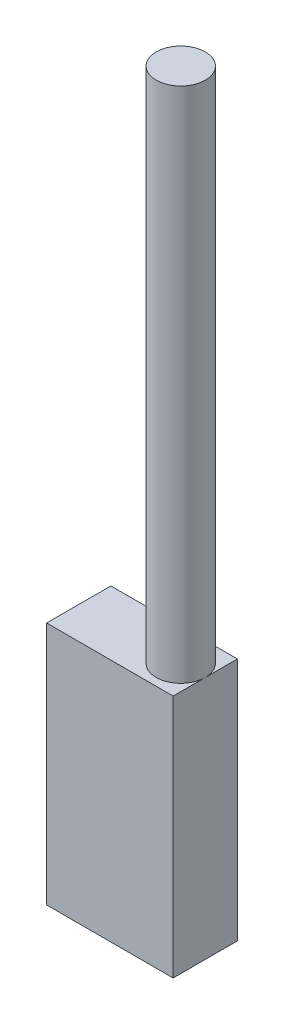
ISO-10303-21;
HEADER;
FILE_DESCRIPTION(('STEP AP214'),'2;1');
FILE_NAME('part.step','',(''),(''),'','','');
FILE_SCHEMA(('AUTOMOTIVE_DESIGN { 1 0 10303 214 1 1 1 1 }'));
ENDSEC;
DATA;
#1=APPLICATION_CONTEXT('core data for automotive mechanical design processes');
#2=APPLICATION_PROTOCOL_DEFINITION('international standard','automotive_design',2000,#1);
#3=PRODUCT_CONTEXT('',#1,'mechanical');
#4=PRODUCT('Part','Part','',(#3));
#5=PRODUCT_RELATED_PRODUCT_CATEGORY('part','',(#4));
#6=PRODUCT_DEFINITION_FORMATION('','',#4);
#7=PRODUCT_DEFINITION_CONTEXT('part definition',#1,'design');
#8=PRODUCT_DEFINITION('design','',#6,#7);
#9=PRODUCT_DEFINITION_SHAPE('','',#8);
#10=(LENGTH_UNIT() NAMED_UNIT(*) SI_UNIT(.MILLI.,.METRE.));
#11=(NAMED_UNIT(*) PLANE_ANGLE_UNIT() SI_UNIT($,.RADIAN.));
#12=(NAMED_UNIT(*) SI_UNIT($,.STERADIAN.) SOLID_ANGLE_UNIT());
#13=UNCERTAINTY_MEASURE_WITH_UNIT(LENGTH_MEASURE(1.E-05),#10,'distance_accuracy_value','');
#14=(GEOMETRIC_REPRESENTATION_CONTEXT(3) GLOBAL_UNCERTAINTY_ASSIGNED_CONTEXT((#13)) GLOBAL_UNIT_ASSIGNED_CONTEXT((#10,
#11,#12)) REPRESENTATION_CONTEXT('',''));
#15=CARTESIAN_POINT('',(0.,0.,0.));
#16=DIRECTION('',(0.,0.,1.));
#17=DIRECTION('',(1.,0.,0.));
#18=AXIS2_PLACEMENT_3D('',#15,#16,#17);
#19=CARTESIAN_POINT('',(0.,0.,13.1));
#20=DIRECTION('',(1.,0.,0.));
#21=DIRECTION('',(0.,0.,-1.));
#22=AXIS2_PLACEMENT_3D('',#19,#20,#21);
#23=PLANE('',#22);
#24=DIRECTION('',(0.,-1.,0.));
#25=VECTOR('',#24,1.);
#26=CARTESIAN_POINT('',(0.,0.,0.));
#27=LINE('',#26,#25);
#28=CARTESIAN_POINT('',(0.,49.8,0.));
#29=VERTEX_POINT('',#28);
#30=CARTESIAN_POINT('',(0.,0.,0.));
#31=VERTEX_POINT('',#30);
#32=EDGE_CURVE('E103',#29,#31,#27,.T.);
#33=ORIENTED_EDGE('',*,*,#32,.T.);
#34=DIRECTION('',(0.,0.,-1.));
#35=VECTOR('',#34,1.);
#36=CARTESIAN_POINT('',(0.,0.,13.1));
#37=LINE('',#36,#35);
#38=CARTESIAN_POINT('',(0.,0.,13.1));
#39=VERTEX_POINT('',#38);
#40=EDGE_CURVE('E11',#39,#31,#37,.T.);
#41=ORIENTED_EDGE('',*,*,#40,.F.);
#42=DIRECTION('',(0.,-1.,0.));
#43=VECTOR('',#42,1.);
#44=CARTESIAN_POINT('',(0.,0.,13.1));
#45=LINE('',#44,#43);
#46=CARTESIAN_POINT('',(0.,49.8,13.1));
#47=VERTEX_POINT('',#46);
#48=EDGE_CURVE('E102',#47,#39,#45,.T.);
#49=ORIENTED_EDGE('',*,*,#48,.F.);
#50=DIRECTION('',(0.,0.,-1.));
#51=VECTOR('',#50,1.);
#52=CARTESIAN_POINT('',(0.,49.8,13.1));
#53=LINE('',#52,#51);
#54=EDGE_CURVE('E93',#47,#29,#53,.T.);
#55=ORIENTED_EDGE('',*,*,#54,.T.);
#56=EDGE_LOOP('',(#33,#41,#49,#55));
#57=FACE_BOUND('',#56,.T.);
#58=ADVANCED_FACE('F33',(#57),#23,.F.);
#59=CARTESIAN_POINT('',(0.,0.,13.1));
#60=DIRECTION('',(0.,1.,0.));
#61=DIRECTION('',(0.,0.,1.));
#62=AXIS2_PLACEMENT_3D('',#59,#60,#61);
#63=PLANE('',#62);
#64=DIRECTION('',(1.,0.,0.));
#65=VECTOR('',#64,1.);
#66=CARTESIAN_POINT('',(0.,0.,0.));
#67=LINE('',#66,#65);
#68=CARTESIAN_POINT('',(25.8,0.,0.));
#69=VERTEX_POINT('',#68);
#70=EDGE_CURVE('E100',#31,#69,#67,.T.);
#71=ORIENTED_EDGE('',*,*,#70,.T.);
#72=DIRECTION('',(0.,0.,-1.));
#73=VECTOR('',#72,1.);
#74=CARTESIAN_POINT('',(25.8,0.,13.1));
#75=LINE('',#74,#73);
#76=CARTESIAN_POINT('',(25.8,0.,13.1));
#77=VERTEX_POINT('',#76);
#78=EDGE_CURVE('E41',#77,#69,#75,.T.);
#79=ORIENTED_EDGE('',*,*,#78,.F.);
#80=DIRECTION('',(1.,0.,0.));
#81=VECTOR('',#80,1.);
#82=CARTESIAN_POINT('',(0.,0.,13.1));
#83=LINE('',#82,#81);
#84=EDGE_CURVE('E78',#39,#77,#83,.T.);
#85=ORIENTED_EDGE('',*,*,#84,.F.);
#86=ORIENTED_EDGE('',*,*,#40,.T.);
#87=EDGE_LOOP('',(#71,#79,#85,#86));
#88=FACE_BOUND('',#87,.T.);
#89=ADVANCED_FACE('F132',(#88),#63,.F.);
#90=CARTESIAN_POINT('',(25.8,0.,13.1));
#91=DIRECTION('',(-1.,0.,0.));
#92=DIRECTION('',(0.,0.,1.));
#93=AXIS2_PLACEMENT_3D('',#90,#91,#92);
#94=PLANE('',#93);
#95=DIRECTION('',(0.,1.,0.));
#96=VECTOR('',#95,1.);
#97=CARTESIAN_POINT('',(25.8,0.,0.));
#98=LINE('',#97,#96);
#99=CARTESIAN_POINT('',(25.8,49.8,0.));
#100=VERTEX_POINT('',#99);
#101=EDGE_CURVE('E92',#69,#100,#98,.T.);
#102=ORIENTED_EDGE('',*,*,#101,.T.);
#103=DIRECTION('',(0.,0.,-1.));
#104=VECTOR('',#103,1.);
#105=CARTESIAN_POINT('',(25.8,49.8,13.1));
#106=LINE('',#105,#104);
#107=CARTESIAN_POINT('',(25.8,49.8,6.55));
#108=VERTEX_POINT('',#107);
#109=EDGE_CURVE('E67',#108,#100,#106,.T.);
#110=ORIENTED_EDGE('',*,*,#109,.F.);
#111=CARTESIAN_POINT('',(25.8,49.8,13.1));
#112=VERTEX_POINT('',#111);
#113=EDGE_CURVE('E82',#112,#108,#106,.T.);
#114=ORIENTED_EDGE('',*,*,#113,.F.);
#115=DIRECTION('',(0.,1.,0.));
#116=VECTOR('',#115,1.);
#117=CARTESIAN_POINT('',(25.8,0.,13.1));
#118=LINE('',#117,#116);
#119=EDGE_CURVE('E96',#77,#112,#118,.T.);
#120=ORIENTED_EDGE('',*,*,#119,.F.);
#121=ORIENTED_EDGE('',*,*,#78,.T.);
#122=EDGE_LOOP('',(#102,#110,#114,#120,#121));
#123=FACE_BOUND('',#122,.T.);
#124=ADVANCED_FACE('F89',(#123),#94,.F.);
#125=CARTESIAN_POINT('',(0.,49.8,13.1));
#126=DIRECTION('',(0.,-1.,0.));
#127=DIRECTION('',(0.,0.,-1.));
#128=AXIS2_PLACEMENT_3D('',#125,#126,#127);
#129=PLANE('',#128);
#130=ORIENTED_EDGE('',*,*,#113,.T.);
#131=CARTESIAN_POINT('',(20.8,49.8,6.55));
#132=DIRECTION('',(0.,1.,0.));
#133=DIRECTION('',(0.,0.,1.));
#134=AXIS2_PLACEMENT_3D('',#131,#132,#133);
#135=CIRCLE('',#134,5.);
#136=EDGE_CURVE('E85',#108,#108,#135,.T.);
#137=ORIENTED_EDGE('',*,*,#136,.F.);
#138=ORIENTED_EDGE('',*,*,#109,.T.);
#139=DIRECTION('',(-1.,0.,0.));
#140=VECTOR('',#139,1.);
#141=CARTESIAN_POINT('',(0.,49.8,0.));
#142=LINE('',#141,#140);
#143=EDGE_CURVE('E71',#100,#29,#142,.T.);
#144=ORIENTED_EDGE('',*,*,#143,.T.);
#145=ORIENTED_EDGE('',*,*,#54,.F.);
#146=DIRECTION('',(-1.,0.,0.));
#147=VECTOR('',#146,1.);
#148=CARTESIAN_POINT('',(0.,49.8,13.1));
#149=LINE('',#148,#147);
#150=EDGE_CURVE('E49',#112,#47,#149,.T.);
#151=ORIENTED_EDGE('',*,*,#150,.F.);
#152=EDGE_LOOP('',(#130,#137,#138,#144,#145,#151));
#153=FACE_BOUND('',#152,.T.);
#154=ADVANCED_FACE('F83',(#153),#129,.F.);
#155=CARTESIAN_POINT('',(0.,0.,13.1));
#156=DIRECTION('',(0.,0.,-1.));
#157=DIRECTION('',(-1.,0.,0.));
#158=AXIS2_PLACEMENT_3D('',#155,#156,#157);
#159=PLANE('',#158);
#160=ORIENTED_EDGE('',*,*,#48,.T.);
#161=ORIENTED_EDGE('',*,*,#84,.T.);
#162=ORIENTED_EDGE('',*,*,#119,.T.);
#163=ORIENTED_EDGE('',*,*,#150,.T.);
#164=EDGE_LOOP('',(#160,#161,#162,#163));
#165=FACE_BOUND('',#164,.T.);
#166=ADVANCED_FACE('F128',(#165),#159,.F.);
#167=CARTESIAN_POINT('',(0.,0.,0.));
#168=DIRECTION('',(0.,0.,-1.));
#169=DIRECTION('',(-1.,0.,0.));
#170=AXIS2_PLACEMENT_3D('',#167,#168,#169);
#171=PLANE('',#170);
#172=ORIENTED_EDGE('',*,*,#32,.F.);
#173=ORIENTED_EDGE('',*,*,#143,.F.);
#174=ORIENTED_EDGE('',*,*,#101,.F.);
#175=ORIENTED_EDGE('',*,*,#70,.F.);
#176=EDGE_LOOP('',(#172,#173,#174,#175));
#177=FACE_BOUND('',#176,.T.);
#178=ADVANCED_FACE('F99',(#177),#171,.T.);
#179=CARTESIAN_POINT('',(20.8,155.3,6.55));
#180=DIRECTION('',(0.,-1.,0.));
#181=DIRECTION('',(0.,0.,-1.));
#182=AXIS2_PLACEMENT_3D('',#179,#180,#181);
#183=CYLINDRICAL_SURFACE('',#182,5.);
#184=CARTESIAN_POINT('',(20.8,155.3,6.55));
#185=DIRECTION('',(0.,1.,0.));
#186=DIRECTION('',(0.,0.,1.));
#187=AXIS2_PLACEMENT_3D('',#184,#185,#186);
#188=CIRCLE('',#187,5.);
#189=CARTESIAN_POINT('',(20.8,155.3,11.55));
#190=VERTEX_POINT('',#189);
#191=EDGE_CURVE('E108',#190,#190,#188,.T.);
#192=ORIENTED_EDGE('',*,*,#191,.F.);
#193=EDGE_LOOP('',(#192));
#194=FACE_BOUND('',#193,.T.);
#195=ORIENTED_EDGE('',*,*,#136,.T.);
#196=EDGE_LOOP('',(#195));
#197=FACE_BOUND('',#196,.T.);
#198=ADVANCED_FACE('F119',(#194,#197),#183,.T.);
#199=CARTESIAN_POINT('',(20.8,155.3,6.55));
#200=DIRECTION('',(0.,1.,0.));
#201=DIRECTION('',(0.,0.,1.));
#202=AXIS2_PLACEMENT_3D('',#199,#200,#201);
#203=PLANE('',#202);
#204=ORIENTED_EDGE('',*,*,#191,.T.);
#205=EDGE_LOOP('',(#204));
#206=FACE_BOUND('',#205,.T.);
#207=ADVANCED_FACE('F117',(#206),#203,.T.);
#208=CLOSED_SHELL('',(#58,#89,#124,#154,#166,#178,#198,#207));
#209=MANIFOLD_SOLID_BREP('B2',#208);
#210=ADVANCED_BREP_SHAPE_REPRESENTATION('',(#18,#209),#14);
#211=SHAPE_DEFINITION_REPRESENTATION(#9,#210);
ENDSEC;
END-ISO-10303-21;
